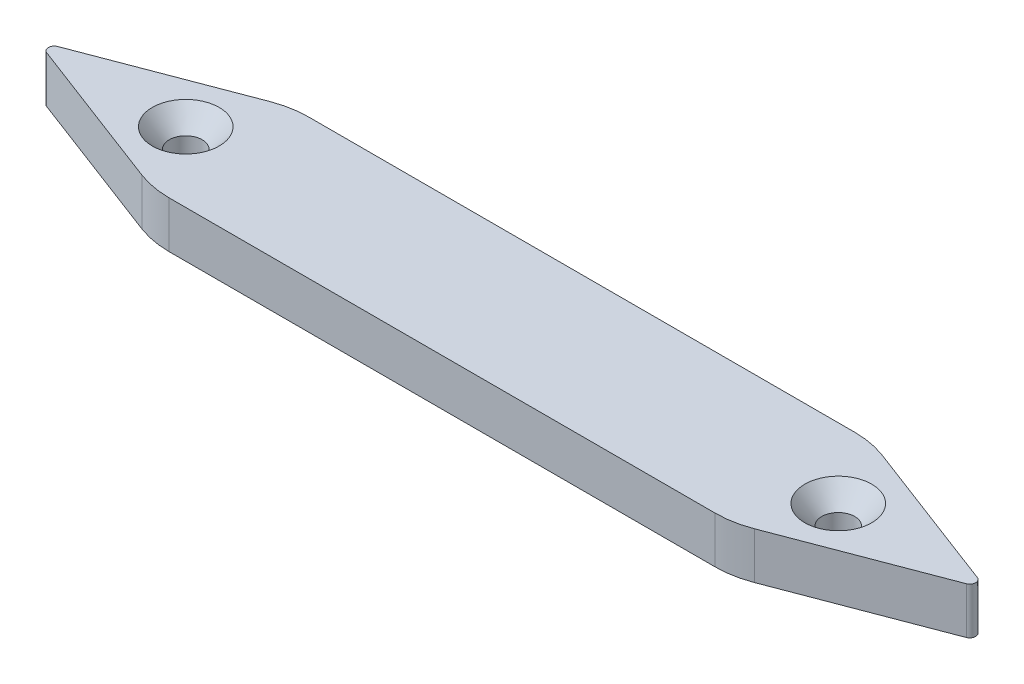
ISO-10303-21;
HEADER;
FILE_DESCRIPTION(('STEP AP214'),'2;1');
FILE_NAME('part.step','',(''),(''),'','','');
FILE_SCHEMA(('AUTOMOTIVE_DESIGN { 1 0 10303 214 1 1 1 1 }'));
ENDSEC;
DATA;
#1=APPLICATION_CONTEXT('core data for automotive mechanical design processes');
#2=APPLICATION_PROTOCOL_DEFINITION('international standard','automotive_design',2000,#1);
#3=PRODUCT_CONTEXT('',#1,'mechanical');
#4=PRODUCT('Part','Part','',(#3));
#5=PRODUCT_RELATED_PRODUCT_CATEGORY('part','',(#4));
#6=PRODUCT_DEFINITION_FORMATION('','',#4);
#7=PRODUCT_DEFINITION_CONTEXT('part definition',#1,'design');
#8=PRODUCT_DEFINITION('design','',#6,#7);
#9=PRODUCT_DEFINITION_SHAPE('','',#8);
#10=(LENGTH_UNIT() NAMED_UNIT(*) SI_UNIT(.MILLI.,.METRE.));
#11=(NAMED_UNIT(*) PLANE_ANGLE_UNIT() SI_UNIT($,.RADIAN.));
#12=(NAMED_UNIT(*) SI_UNIT($,.STERADIAN.) SOLID_ANGLE_UNIT());
#13=UNCERTAINTY_MEASURE_WITH_UNIT(LENGTH_MEASURE(1.E-05),#10,'distance_accuracy_value','');
#14=(GEOMETRIC_REPRESENTATION_CONTEXT(3) GLOBAL_UNCERTAINTY_ASSIGNED_CONTEXT((#13)) GLOBAL_UNIT_ASSIGNED_CONTEXT((#10,
#11,#12)) REPRESENTATION_CONTEXT('',''));
#15=CARTESIAN_POINT('',(0.,0.,0.));
#16=DIRECTION('',(0.,0.,1.));
#17=DIRECTION('',(1.,0.,0.));
#18=AXIS2_PLACEMENT_3D('',#15,#16,#17);
#19=CARTESIAN_POINT('',(-62.3678648511801,22.225,0.));
#20=DIRECTION('',(0.,-1.,0.));
#21=DIRECTION('',(0.,0.,-1.));
#22=AXIS2_PLACEMENT_3D('',#19,#20,#21);
#23=PLANE('',#22);
#24=CARTESIAN_POINT('',(-44.45,22.225,0.));
#25=DIRECTION('',(0.,1.,0.));
#26=DIRECTION('',(0.,0.,1.));
#27=AXIS2_PLACEMENT_3D('',#24,#25,#26);
#28=CIRCLE('',#27,4.5593);
#29=CARTESIAN_POINT('',(-44.45,22.225,4.5593));
#30=VERTEX_POINT('',#29);
#31=EDGE_CURVE('E239',#30,#30,#28,.T.);
#32=ORIENTED_EDGE('',*,*,#31,.F.);
#33=EDGE_LOOP('',(#32));
#34=FACE_BOUND('',#33,.T.);
#35=CARTESIAN_POINT('',(-62.3678648511801,22.225,0.));
#36=DIRECTION('',(0.,1.,0.));
#37=DIRECTION('',(0.,0.,-1.));
#38=AXIS2_PLACEMENT_3D('',#35,#36,#37);
#39=CIRCLE('',#38,0.793750000000001);
#40=CARTESIAN_POINT('',(-62.6498189486751,22.225,-0.741984467092001));
#41=VERTEX_POINT('',#40);
#42=CARTESIAN_POINT('',(-62.6498189486751,22.225,0.741984467092001));
#43=VERTEX_POINT('',#42);
#44=EDGE_CURVE('E213',#41,#43,#39,.T.);
#45=ORIENTED_EDGE('',*,*,#44,.T.);
#46=DIRECTION('',(0.934783580588349,0.,0.355217760623573));
#47=VECTOR('',#46,1.);
#48=CARTESIAN_POINT('',(-41.7162215634645,22.225,8.69675147347203));
#49=LINE('',#48,#47);
#50=CARTESIAN_POINT('',(-41.7162215634645,22.225,8.69675147347203));
#51=VERTEX_POINT('',#50);
#52=EDGE_CURVE('E210',#43,#51,#49,.T.);
#53=ORIENTED_EDGE('',*,*,#52,.T.);
#54=CARTESIAN_POINT('',(-37.2049560035451,22.225,-3.17500000000001));
#55=DIRECTION('',(0.,1.,0.));
#56=DIRECTION('',(0.,0.,-1.));
#57=AXIS2_PLACEMENT_3D('',#54,#55,#56);
#58=CIRCLE('',#57,12.7);
#59=CARTESIAN_POINT('',(-37.2049560035451,22.225,9.525));
#60=VERTEX_POINT('',#59);
#61=EDGE_CURVE('E207',#51,#60,#58,.T.);
#62=ORIENTED_EDGE('',*,*,#61,.T.);
#63=DIRECTION('',(1.,0.,0.));
#64=VECTOR('',#63,1.);
#65=CARTESIAN_POINT('',(37.2049560035452,22.225,9.525));
#66=LINE('',#65,#64);
#67=CARTESIAN_POINT('',(37.2049560035452,22.225,9.525));
#68=VERTEX_POINT('',#67);
#69=EDGE_CURVE('E204',#60,#68,#66,.T.);
#70=ORIENTED_EDGE('',*,*,#69,.T.);
#71=CARTESIAN_POINT('',(37.2049560035452,22.225,-3.17500000000002));
#72=DIRECTION('',(0.,1.,0.));
#73=DIRECTION('',(0.,0.,1.));
#74=AXIS2_PLACEMENT_3D('',#71,#72,#73);
#75=CIRCLE('',#74,12.7);
#76=CARTESIAN_POINT('',(41.7162215634645,22.225,8.69675147347204));
#77=VERTEX_POINT('',#76);
#78=EDGE_CURVE('E201',#68,#77,#75,.T.);
#79=ORIENTED_EDGE('',*,*,#78,.T.);
#80=DIRECTION('',(0.934783580588349,0.,-0.355217760623573));
#81=VECTOR('',#80,1.);
#82=CARTESIAN_POINT('',(41.7162215634645,22.225,8.69675147347204));
#83=LINE('',#82,#81);
#84=CARTESIAN_POINT('',(62.6498189486751,22.225,0.741984467092017));
#85=VERTEX_POINT('',#84);
#86=EDGE_CURVE('E198',#77,#85,#83,.T.);
#87=ORIENTED_EDGE('',*,*,#86,.T.);
#88=CARTESIAN_POINT('',(62.3678648511801,22.225,0.));
#89=DIRECTION('',(0.,1.,0.));
#90=DIRECTION('',(0.,0.,1.));
#91=AXIS2_PLACEMENT_3D('',#88,#89,#90);
#92=CIRCLE('',#91,0.793750000000015);
#93=CARTESIAN_POINT('',(62.6498189486751,22.225,-0.741984467092032));
#94=VERTEX_POINT('',#93);
#95=EDGE_CURVE('E196',#85,#94,#92,.T.);
#96=ORIENTED_EDGE('',*,*,#95,.T.);
#97=DIRECTION('',(-0.934783580588349,0.,-0.355217760623573));
#98=VECTOR('',#97,1.);
#99=CARTESIAN_POINT('',(41.7162215634645,22.225,-8.69675147347204));
#100=LINE('',#99,#98);
#101=CARTESIAN_POINT('',(41.7162215634645,22.225,-8.69675147347204));
#102=VERTEX_POINT('',#101);
#103=EDGE_CURVE('E147',#94,#102,#100,.T.);
#104=ORIENTED_EDGE('',*,*,#103,.T.);
#105=CARTESIAN_POINT('',(37.2049560035452,22.225,3.17500000000002));
#106=DIRECTION('',(0.,1.,0.));
#107=DIRECTION('',(0.,0.,-1.));
#108=AXIS2_PLACEMENT_3D('',#105,#106,#107);
#109=CIRCLE('',#108,12.7);
#110=CARTESIAN_POINT('',(37.2049560035452,22.225,-9.525));
#111=VERTEX_POINT('',#110);
#112=EDGE_CURVE('E180',#102,#111,#109,.T.);
#113=ORIENTED_EDGE('',*,*,#112,.T.);
#114=DIRECTION('',(-1.,0.,0.));
#115=VECTOR('',#114,1.);
#116=CARTESIAN_POINT('',(37.2049560035452,22.225,-9.525));
#117=LINE('',#116,#115);
#118=CARTESIAN_POINT('',(-37.2049560035451,22.225,-9.52499999999999));
#119=VERTEX_POINT('',#118);
#120=EDGE_CURVE('E188',#111,#119,#117,.T.);
#121=ORIENTED_EDGE('',*,*,#120,.T.);
#122=CARTESIAN_POINT('',(-37.2049560035451,22.225,3.17500000000001));
#123=DIRECTION('',(0.,1.,0.));
#124=DIRECTION('',(0.,0.,1.));
#125=AXIS2_PLACEMENT_3D('',#122,#123,#124);
#126=CIRCLE('',#125,12.7);
#127=CARTESIAN_POINT('',(-41.7162215634645,22.225,-8.69675147347203));
#128=VERTEX_POINT('',#127);
#129=EDGE_CURVE('E192',#119,#128,#126,.T.);
#130=ORIENTED_EDGE('',*,*,#129,.T.);
#131=DIRECTION('',(-0.934783580588349,0.,0.355217760623573));
#132=VECTOR('',#131,1.);
#133=CARTESIAN_POINT('',(-41.7162215634645,22.225,-8.69675147347203));
#134=LINE('',#133,#132);
#135=EDGE_CURVE('E165',#128,#41,#134,.T.);
#136=ORIENTED_EDGE('',*,*,#135,.T.);
#137=EDGE_LOOP('',(#45,#53,#62,#70,#79,#87,#96,#104,#113,#121,#130,#136));
#138=FACE_BOUND('',#137,.T.);
#139=CARTESIAN_POINT('',(44.45,22.225,0.));
#140=DIRECTION('',(0.,1.,0.));
#141=DIRECTION('',(0.,0.,1.));
#142=AXIS2_PLACEMENT_3D('',#139,#140,#141);
#143=CIRCLE('',#142,4.5593);
#144=CARTESIAN_POINT('',(44.45,22.225,4.5593));
#145=VERTEX_POINT('',#144);
#146=EDGE_CURVE('E233',#145,#145,#143,.T.);
#147=ORIENTED_EDGE('',*,*,#146,.F.);
#148=EDGE_LOOP('',(#147));
#149=FACE_BOUND('',#148,.T.);
#150=ADVANCED_FACE('F33',(#34,#138,#149),#23,.F.);
#151=CARTESIAN_POINT('',(-62.3678648511801,-10.,0.));
#152=DIRECTION('',(0.,1.,0.));
#153=DIRECTION('',(0.,0.,1.));
#154=AXIS2_PLACEMENT_3D('',#151,#152,#153);
#155=CYLINDRICAL_SURFACE('',#154,0.793750000000001);
#156=CARTESIAN_POINT('',(-62.3678648511801,15.875,0.));
#157=DIRECTION('',(0.,1.,0.));
#158=DIRECTION('',(0.,0.,1.));
#159=AXIS2_PLACEMENT_3D('',#156,#157,#158);
#160=CIRCLE('',#159,0.793750000000001);
#161=CARTESIAN_POINT('',(-62.6498189486751,15.875,0.741984467092002));
#162=VERTEX_POINT('',#161);
#163=CARTESIAN_POINT('',(-62.6498189486751,15.875,-0.741984467092001));
#164=VERTEX_POINT('',#163);
#165=EDGE_CURVE('E141',#162,#164,#160,.F.);
#166=ORIENTED_EDGE('',*,*,#165,.F.);
#167=DIRECTION('',(0.,1.,0.));
#168=VECTOR('',#167,1.);
#169=CARTESIAN_POINT('',(-62.6498189486751,-10.,0.741984467092001));
#170=LINE('',#169,#168);
#171=EDGE_CURVE('E163',#162,#43,#170,.T.);
#172=ORIENTED_EDGE('',*,*,#171,.T.);
#173=ORIENTED_EDGE('',*,*,#44,.F.);
#174=DIRECTION('',(0.,1.,0.));
#175=VECTOR('',#174,1.);
#176=CARTESIAN_POINT('',(-62.6498189486751,-10.,-0.741984467092001));
#177=LINE('',#176,#175);
#178=EDGE_CURVE('E49',#164,#41,#177,.T.);
#179=ORIENTED_EDGE('',*,*,#178,.F.);
#180=EDGE_LOOP('',(#166,#172,#173,#179));
#181=FACE_BOUND('',#180,.T.);
#182=ADVANCED_FACE('F35',(#181),#155,.T.);
#183=CARTESIAN_POINT('',(62.3678648511801,-10.,0.));
#184=DIRECTION('',(0.,1.,0.));
#185=DIRECTION('',(0.,0.,1.));
#186=AXIS2_PLACEMENT_3D('',#183,#184,#185);
#187=CYLINDRICAL_SURFACE('',#186,0.793750000000015);
#188=CARTESIAN_POINT('',(62.3678648511801,15.875,0.));
#189=DIRECTION('',(0.,1.,0.));
#190=DIRECTION('',(0.,0.,1.));
#191=AXIS2_PLACEMENT_3D('',#188,#189,#190);
#192=CIRCLE('',#191,0.793750000000015);
#193=CARTESIAN_POINT('',(62.6498189486751,15.875,-0.741984467092015));
#194=VERTEX_POINT('',#193);
#195=CARTESIAN_POINT('',(62.6498189486751,15.875,0.741984467092003));
#196=VERTEX_POINT('',#195);
#197=EDGE_CURVE('E128',#194,#196,#192,.F.);
#198=ORIENTED_EDGE('',*,*,#197,.F.);
#199=DIRECTION('',(0.,1.,0.));
#200=VECTOR('',#199,1.);
#201=CARTESIAN_POINT('',(62.6498189486751,-10.,-0.741984467092032));
#202=LINE('',#201,#200);
#203=EDGE_CURVE('E138',#194,#94,#202,.T.);
#204=ORIENTED_EDGE('',*,*,#203,.T.);
#205=ORIENTED_EDGE('',*,*,#95,.F.);
#206=DIRECTION('',(0.,1.,0.));
#207=VECTOR('',#206,1.);
#208=CARTESIAN_POINT('',(62.6498189486751,-10.,0.741984467092017));
#209=LINE('',#208,#207);
#210=EDGE_CURVE('E140',#196,#85,#209,.T.);
#211=ORIENTED_EDGE('',*,*,#210,.F.);
#212=EDGE_LOOP('',(#198,#204,#205,#211));
#213=FACE_BOUND('',#212,.T.);
#214=ADVANCED_FACE('F136',(#213),#187,.T.);
#215=CARTESIAN_POINT('',(-37.2049560035451,-10.,3.17500000000001));
#216=DIRECTION('',(0.,1.,0.));
#217=DIRECTION('',(0.,0.,1.));
#218=AXIS2_PLACEMENT_3D('',#215,#216,#217);
#219=CYLINDRICAL_SURFACE('',#218,12.7);
#220=CARTESIAN_POINT('',(-37.2049560035451,15.875,3.17500000000001));
#221=DIRECTION('',(0.,1.,0.));
#222=DIRECTION('',(0.,0.,1.));
#223=AXIS2_PLACEMENT_3D('',#220,#221,#222);
#224=CIRCLE('',#223,12.7);
#225=CARTESIAN_POINT('',(-41.7162215634645,15.875,-8.69675147347203));
#226=VERTEX_POINT('',#225);
#227=CARTESIAN_POINT('',(-37.2049560035451,15.875,-9.525));
#228=VERTEX_POINT('',#227);
#229=EDGE_CURVE('E225',#226,#228,#224,.F.);
#230=ORIENTED_EDGE('',*,*,#229,.F.);
#231=DIRECTION('',(0.,1.,0.));
#232=VECTOR('',#231,1.);
#233=CARTESIAN_POINT('',(-41.7162215634645,-10.,-8.69675147347203));
#234=LINE('',#233,#232);
#235=EDGE_CURVE('E57',#226,#128,#234,.T.);
#236=ORIENTED_EDGE('',*,*,#235,.T.);
#237=ORIENTED_EDGE('',*,*,#129,.F.);
#238=DIRECTION('',(0.,1.,0.));
#239=VECTOR('',#238,1.);
#240=CARTESIAN_POINT('',(-37.2049560035451,-10.,-9.52499999999999));
#241=LINE('',#240,#239);
#242=EDGE_CURVE('E170',#228,#119,#241,.T.);
#243=ORIENTED_EDGE('',*,*,#242,.F.);
#244=EDGE_LOOP('',(#230,#236,#237,#243));
#245=FACE_BOUND('',#244,.T.);
#246=ADVANCED_FACE('F279',(#245),#219,.T.);
#247=CARTESIAN_POINT('',(37.2049560035452,-10.,-9.525));
#248=DIRECTION('',(0.,0.,-1.));
#249=DIRECTION('',(-1.,0.,0.));
#250=AXIS2_PLACEMENT_3D('',#247,#248,#249);
#251=PLANE('',#250);
#252=DIRECTION('',(1.,0.,0.));
#253=VECTOR('',#252,1.);
#254=CARTESIAN_POINT('',(67.7785323187383,15.875,-9.525));
#255=LINE('',#254,#253);
#256=CARTESIAN_POINT('',(37.2049560035452,15.875,-9.525));
#257=VERTEX_POINT('',#256);
#258=EDGE_CURVE('E228',#228,#257,#255,.T.);
#259=ORIENTED_EDGE('',*,*,#258,.F.);
#260=ORIENTED_EDGE('',*,*,#242,.T.);
#261=ORIENTED_EDGE('',*,*,#120,.F.);
#262=DIRECTION('',(0.,1.,0.));
#263=VECTOR('',#262,1.);
#264=CARTESIAN_POINT('',(37.2049560035452,-10.,-9.525));
#265=LINE('',#264,#263);
#266=EDGE_CURVE('E150',#257,#111,#265,.T.);
#267=ORIENTED_EDGE('',*,*,#266,.F.);
#268=EDGE_LOOP('',(#259,#260,#261,#267));
#269=FACE_BOUND('',#268,.T.);
#270=ADVANCED_FACE('F190',(#269),#251,.T.);
#271=CARTESIAN_POINT('',(37.2049560035452,-10.,3.17500000000002));
#272=DIRECTION('',(0.,1.,0.));
#273=DIRECTION('',(0.,0.,1.));
#274=AXIS2_PLACEMENT_3D('',#271,#272,#273);
#275=CYLINDRICAL_SURFACE('',#274,12.7);
#276=CARTESIAN_POINT('',(37.2049560035452,15.875,3.17500000000002));
#277=DIRECTION('',(0.,1.,0.));
#278=DIRECTION('',(0.,0.,1.));
#279=AXIS2_PLACEMENT_3D('',#276,#277,#278);
#280=CIRCLE('',#279,12.7);
#281=CARTESIAN_POINT('',(41.7162215634645,15.875,-8.69675147347204));
#282=VERTEX_POINT('',#281);
#283=EDGE_CURVE('E131',#257,#282,#280,.F.);
#284=ORIENTED_EDGE('',*,*,#283,.F.);
#285=ORIENTED_EDGE('',*,*,#266,.T.);
#286=ORIENTED_EDGE('',*,*,#112,.F.);
#287=DIRECTION('',(0.,1.,0.));
#288=VECTOR('',#287,1.);
#289=CARTESIAN_POINT('',(41.7162215634645,-10.,-8.69675147347204));
#290=LINE('',#289,#288);
#291=EDGE_CURVE('E148',#282,#102,#290,.T.);
#292=ORIENTED_EDGE('',*,*,#291,.F.);
#293=EDGE_LOOP('',(#284,#285,#286,#292));
#294=FACE_BOUND('',#293,.T.);
#295=ADVANCED_FACE('F179',(#294),#275,.T.);
#296=CARTESIAN_POINT('',(37.2049560035452,-10.,-3.17500000000002));
#297=DIRECTION('',(0.,1.,0.));
#298=DIRECTION('',(0.,0.,1.));
#299=AXIS2_PLACEMENT_3D('',#296,#297,#298);
#300=CYLINDRICAL_SURFACE('',#299,12.7);
#301=CARTESIAN_POINT('',(37.2049560035452,15.875,-3.17500000000002));
#302=DIRECTION('',(0.,1.,0.));
#303=DIRECTION('',(0.,0.,1.));
#304=AXIS2_PLACEMENT_3D('',#301,#302,#303);
#305=CIRCLE('',#304,12.7);
#306=CARTESIAN_POINT('',(41.7162215634645,15.875,8.69675147347204));
#307=VERTEX_POINT('',#306);
#308=CARTESIAN_POINT('',(37.2049560035452,15.875,9.525));
#309=VERTEX_POINT('',#308);
#310=EDGE_CURVE('E217',#307,#309,#305,.F.);
#311=ORIENTED_EDGE('',*,*,#310,.F.);
#312=DIRECTION('',(0.,1.,0.));
#313=VECTOR('',#312,1.);
#314=CARTESIAN_POINT('',(41.7162215634645,-10.,8.69675147347204));
#315=LINE('',#314,#313);
#316=EDGE_CURVE('E152',#307,#77,#315,.T.);
#317=ORIENTED_EDGE('',*,*,#316,.T.);
#318=ORIENTED_EDGE('',*,*,#78,.F.);
#319=DIRECTION('',(0.,1.,0.));
#320=VECTOR('',#319,1.);
#321=CARTESIAN_POINT('',(37.2049560035452,-10.,9.525));
#322=LINE('',#321,#320);
#323=EDGE_CURVE('E157',#309,#68,#322,.T.);
#324=ORIENTED_EDGE('',*,*,#323,.F.);
#325=EDGE_LOOP('',(#311,#317,#318,#324));
#326=FACE_BOUND('',#325,.T.);
#327=ADVANCED_FACE('F286',(#326),#300,.T.);
#328=CARTESIAN_POINT('',(37.2049560035452,-10.,9.525));
#329=DIRECTION('',(0.,0.,1.));
#330=DIRECTION('',(1.,0.,0.));
#331=AXIS2_PLACEMENT_3D('',#328,#329,#330);
#332=PLANE('',#331);
#333=DIRECTION('',(-1.,0.,0.));
#334=VECTOR('',#333,1.);
#335=CARTESIAN_POINT('',(-68.6771113456913,15.875,9.525));
#336=LINE('',#335,#334);
#337=CARTESIAN_POINT('',(-37.2049560035451,15.875,9.525));
#338=VERTEX_POINT('',#337);
#339=EDGE_CURVE('E221',#309,#338,#336,.T.);
#340=ORIENTED_EDGE('',*,*,#339,.F.);
#341=ORIENTED_EDGE('',*,*,#323,.T.);
#342=ORIENTED_EDGE('',*,*,#69,.F.);
#343=DIRECTION('',(0.,1.,0.));
#344=VECTOR('',#343,1.);
#345=CARTESIAN_POINT('',(-37.2049560035451,-10.,9.525));
#346=LINE('',#345,#344);
#347=EDGE_CURVE('E159',#338,#60,#346,.T.);
#348=ORIENTED_EDGE('',*,*,#347,.F.);
#349=EDGE_LOOP('',(#340,#341,#342,#348));
#350=FACE_BOUND('',#349,.T.);
#351=ADVANCED_FACE('F296',(#350),#332,.T.);
#352=CARTESIAN_POINT('',(-37.2049560035451,-10.,-3.17500000000001));
#353=DIRECTION('',(0.,1.,0.));
#354=DIRECTION('',(0.,0.,1.));
#355=AXIS2_PLACEMENT_3D('',#352,#353,#354);
#356=CYLINDRICAL_SURFACE('',#355,12.7);
#357=CARTESIAN_POINT('',(-37.2049560035451,15.875,-3.17500000000001));
#358=DIRECTION('',(0.,1.,0.));
#359=DIRECTION('',(0.,0.,1.));
#360=AXIS2_PLACEMENT_3D('',#357,#358,#359);
#361=CIRCLE('',#360,12.7);
#362=CARTESIAN_POINT('',(-41.7162215634645,15.875,8.69675147347203));
#363=VERTEX_POINT('',#362);
#364=EDGE_CURVE('E219',#338,#363,#361,.F.);
#365=ORIENTED_EDGE('',*,*,#364,.F.);
#366=ORIENTED_EDGE('',*,*,#347,.T.);
#367=ORIENTED_EDGE('',*,*,#61,.F.);
#368=DIRECTION('',(0.,1.,0.));
#369=VECTOR('',#368,1.);
#370=CARTESIAN_POINT('',(-41.7162215634645,-10.,8.69675147347203));
#371=LINE('',#370,#369);
#372=EDGE_CURVE('E161',#363,#51,#371,.T.);
#373=ORIENTED_EDGE('',*,*,#372,.F.);
#374=EDGE_LOOP('',(#365,#366,#367,#373));
#375=FACE_BOUND('',#374,.T.);
#376=ADVANCED_FACE('F278',(#375),#356,.T.);
#377=CARTESIAN_POINT('',(-41.7162215634645,-10.,-8.69675147347203));
#378=DIRECTION('',(-0.355217760623573,0.,-0.934783580588349));
#379=DIRECTION('',(-0.934783580588349,0.,0.355217760623573));
#380=AXIS2_PLACEMENT_3D('',#377,#378,#379);
#381=PLANE('',#380);
#382=DIRECTION('',(0.934783580588349,0.,-0.355217760623573));
#383=VECTOR('',#382,1.);
#384=CARTESIAN_POINT('',(-41.7162215634645,15.875,-8.69675147347203));
#385=LINE('',#384,#383);
#386=EDGE_CURVE('E223',#164,#226,#385,.T.);
#387=ORIENTED_EDGE('',*,*,#386,.F.);
#388=ORIENTED_EDGE('',*,*,#178,.T.);
#389=ORIENTED_EDGE('',*,*,#135,.F.);
#390=ORIENTED_EDGE('',*,*,#235,.F.);
#391=EDGE_LOOP('',(#387,#388,#389,#390));
#392=FACE_BOUND('',#391,.T.);
#393=ADVANCED_FACE('F275',(#392),#381,.T.);
#394=CARTESIAN_POINT('',(41.7162215634645,-10.,-8.69675147347204));
#395=DIRECTION('',(0.355217760623573,0.,-0.934783580588349));
#396=DIRECTION('',(-0.934783580588349,0.,-0.355217760623573));
#397=AXIS2_PLACEMENT_3D('',#394,#395,#396);
#398=PLANE('',#397);
#399=ORIENTED_EDGE('',*,*,#203,.F.);
#400=DIRECTION('',(0.934783580588349,0.,0.355217760623573));
#401=VECTOR('',#400,1.);
#402=CARTESIAN_POINT('',(41.7162215634645,15.875,-8.69675147347204));
#403=LINE('',#402,#401);
#404=EDGE_CURVE('E11',#282,#194,#403,.T.);
#405=ORIENTED_EDGE('',*,*,#404,.F.);
#406=ORIENTED_EDGE('',*,*,#291,.T.);
#407=ORIENTED_EDGE('',*,*,#103,.F.);
#408=EDGE_LOOP('',(#399,#405,#406,#407));
#409=FACE_BOUND('',#408,.T.);
#410=ADVANCED_FACE('F145',(#409),#398,.T.);
#411=CARTESIAN_POINT('',(41.7162215634645,-10.,8.69675147347204));
#412=DIRECTION('',(0.355217760623573,0.,0.934783580588349));
#413=DIRECTION('',(0.934783580588349,0.,-0.355217760623573));
#414=AXIS2_PLACEMENT_3D('',#411,#412,#413);
#415=PLANE('',#414);
#416=DIRECTION('',(-0.934783580588349,0.,0.355217760623573));
#417=VECTOR('',#416,1.);
#418=CARTESIAN_POINT('',(41.7162215634645,15.875,8.69675147347204));
#419=LINE('',#418,#417);
#420=EDGE_CURVE('E215',#196,#307,#419,.T.);
#421=ORIENTED_EDGE('',*,*,#420,.F.);
#422=ORIENTED_EDGE('',*,*,#210,.T.);
#423=ORIENTED_EDGE('',*,*,#86,.F.);
#424=ORIENTED_EDGE('',*,*,#316,.F.);
#425=EDGE_LOOP('',(#421,#422,#423,#424));
#426=FACE_BOUND('',#425,.T.);
#427=ADVANCED_FACE('F263',(#426),#415,.T.);
#428=CARTESIAN_POINT('',(-41.7162215634645,-10.,8.69675147347203));
#429=DIRECTION('',(-0.355217760623573,0.,0.934783580588349));
#430=DIRECTION('',(0.934783580588349,0.,0.355217760623573));
#431=AXIS2_PLACEMENT_3D('',#428,#429,#430);
#432=PLANE('',#431);
#433=ORIENTED_EDGE('',*,*,#171,.F.);
#434=DIRECTION('',(-0.934783580588349,0.,-0.355217760623573));
#435=VECTOR('',#434,1.);
#436=CARTESIAN_POINT('',(-41.7162215634645,15.875,8.69675147347203));
#437=LINE('',#436,#435);
#438=EDGE_CURVE('E42',#363,#162,#437,.T.);
#439=ORIENTED_EDGE('',*,*,#438,.F.);
#440=ORIENTED_EDGE('',*,*,#372,.T.);
#441=ORIENTED_EDGE('',*,*,#52,.F.);
#442=EDGE_LOOP('',(#433,#439,#440,#441));
#443=FACE_BOUND('',#442,.T.);
#444=ADVANCED_FACE('F254',(#443),#432,.T.);
#445=CARTESIAN_POINT('',(-68.6771113456913,15.875,4.76249999999999));
#446=DIRECTION('',(0.,1.,0.));
#447=DIRECTION('',(0.,0.,1.));
#448=AXIS2_PLACEMENT_3D('',#445,#446,#447);
#449=PLANE('',#448);
#450=ORIENTED_EDGE('',*,*,#197,.T.);
#451=ORIENTED_EDGE('',*,*,#420,.T.);
#452=ORIENTED_EDGE('',*,*,#310,.T.);
#453=ORIENTED_EDGE('',*,*,#339,.T.);
#454=ORIENTED_EDGE('',*,*,#364,.T.);
#455=ORIENTED_EDGE('',*,*,#438,.T.);
#456=ORIENTED_EDGE('',*,*,#165,.T.);
#457=ORIENTED_EDGE('',*,*,#386,.T.);
#458=ORIENTED_EDGE('',*,*,#229,.T.);
#459=ORIENTED_EDGE('',*,*,#258,.T.);
#460=ORIENTED_EDGE('',*,*,#283,.T.);
#461=ORIENTED_EDGE('',*,*,#404,.T.);
#462=EDGE_LOOP('',(#450,#451,#452,#453,#454,#455,#456,#457,#458,#459,#460,#461));
#463=FACE_BOUND('',#462,.T.);
#464=CARTESIAN_POINT('',(-44.45,15.875,0.));
#465=DIRECTION('',(0.,1.,0.));
#466=DIRECTION('',(0.,0.,1.));
#467=AXIS2_PLACEMENT_3D('',#464,#465,#466);
#468=CIRCLE('',#467,2.24789999999999);
#469=CARTESIAN_POINT('',(-44.45,15.875,2.24789999999999));
#470=VERTEX_POINT('',#469);
#471=EDGE_CURVE('E37',#470,#470,#468,.F.);
#472=ORIENTED_EDGE('',*,*,#471,.F.);
#473=EDGE_LOOP('',(#472));
#474=FACE_BOUND('',#473,.T.);
#475=CARTESIAN_POINT('',(44.45,15.875,0.));
#476=DIRECTION('',(0.,1.,0.));
#477=DIRECTION('',(0.,0.,1.));
#478=AXIS2_PLACEMENT_3D('',#475,#476,#477);
#479=CIRCLE('',#478,2.24789999999999);
#480=CARTESIAN_POINT('',(44.45,15.875,2.24789999999999));
#481=VERTEX_POINT('',#480);
#482=EDGE_CURVE('E142',#481,#481,#479,.F.);
#483=ORIENTED_EDGE('',*,*,#482,.F.);
#484=EDGE_LOOP('',(#483));
#485=FACE_BOUND('',#484,.T.);
#486=ADVANCED_FACE('F126',(#463,#474,#485),#449,.F.);
#487=CARTESIAN_POINT('',(44.45,22.225,0.));
#488=DIRECTION('',(0.,1.,0.));
#489=DIRECTION('',(0.,0.,1.));
#490=AXIS2_PLACEMENT_3D('',#487,#488,#489);
#491=CYLINDRICAL_SURFACE('',#490,2.24789999999999);
#492=ORIENTED_EDGE('',*,*,#482,.T.);
#493=EDGE_LOOP('',(#492));
#494=FACE_BOUND('',#493,.T.);
#495=CARTESIAN_POINT('',(44.45,19.5660384635494,0.));
#496=DIRECTION('',(0.,1.,0.));
#497=DIRECTION('',(0.,0.,1.));
#498=AXIS2_PLACEMENT_3D('',#495,#496,#497);
#499=CIRCLE('',#498,2.24789999999998);
#500=CARTESIAN_POINT('',(44.45,19.5660384635494,2.24789999999998));
#501=VERTEX_POINT('',#500);
#502=EDGE_CURVE('E230',#501,#501,#499,.T.);
#503=ORIENTED_EDGE('',*,*,#502,.T.);
#504=EDGE_LOOP('',(#503));
#505=FACE_BOUND('',#504,.T.);
#506=ADVANCED_FACE('F253',(#494,#505),#491,.F.);
#507=CARTESIAN_POINT('',(44.45,22.225,0.));
#508=DIRECTION('',(0.,1.,0.));
#509=DIRECTION('',(0.,0.,1.));
#510=AXIS2_PLACEMENT_3D('',#507,#508,#509);
#511=CONICAL_SURFACE('',#510,4.5593,0.715584993317677);
#512=ORIENTED_EDGE('',*,*,#502,.F.);
#513=EDGE_LOOP('',(#512));
#514=FACE_BOUND('',#513,.T.);
#515=ORIENTED_EDGE('',*,*,#146,.T.);
#516=EDGE_LOOP('',(#515));
#517=FACE_BOUND('',#516,.T.);
#518=ADVANCED_FACE('F260',(#514,#517),#511,.F.);
#519=CARTESIAN_POINT('',(-44.45,22.225,0.));
#520=DIRECTION('',(0.,1.,0.));
#521=DIRECTION('',(0.,0.,1.));
#522=AXIS2_PLACEMENT_3D('',#519,#520,#521);
#523=CYLINDRICAL_SURFACE('',#522,2.24789999999999);
#524=ORIENTED_EDGE('',*,*,#471,.T.);
#525=EDGE_LOOP('',(#524));
#526=FACE_BOUND('',#525,.T.);
#527=CARTESIAN_POINT('',(-44.45,19.5660384635494,0.));
#528=DIRECTION('',(0.,1.,0.));
#529=DIRECTION('',(0.,0.,1.));
#530=AXIS2_PLACEMENT_3D('',#527,#528,#529);
#531=CIRCLE('',#530,2.24789999999999);
#532=CARTESIAN_POINT('',(-44.45,19.5660384635494,2.24789999999999));
#533=VERTEX_POINT('',#532);
#534=EDGE_CURVE('E236',#533,#533,#531,.T.);
#535=ORIENTED_EDGE('',*,*,#534,.T.);
#536=EDGE_LOOP('',(#535));
#537=FACE_BOUND('',#536,.T.);
#538=ADVANCED_FACE('F249',(#526,#537),#523,.F.);
#539=CARTESIAN_POINT('',(-44.45,22.225,0.));
#540=DIRECTION('',(0.,1.,0.));
#541=DIRECTION('',(0.,0.,1.));
#542=AXIS2_PLACEMENT_3D('',#539,#540,#541);
#543=CONICAL_SURFACE('',#542,4.5593,0.715584993317674);
#544=ORIENTED_EDGE('',*,*,#534,.F.);
#545=EDGE_LOOP('',(#544));
#546=FACE_BOUND('',#545,.T.);
#547=ORIENTED_EDGE('',*,*,#31,.T.);
#548=EDGE_LOOP('',(#547));
#549=FACE_BOUND('',#548,.T.);
#550=ADVANCED_FACE('F367',(#546,#549),#543,.F.);
#551=CLOSED_SHELL('',(#150,#182,#214,#246,#270,#295,#327,#351,#376,#393,#410,#427,#444,#486,
#506,#518,#538,#550));
#552=MANIFOLD_SOLID_BREP('B2',#551);
#553=ADVANCED_BREP_SHAPE_REPRESENTATION('',(#18,#552),#14);
#554=SHAPE_DEFINITION_REPRESENTATION(#9,#553);
ENDSEC;
END-ISO-10303-21;
